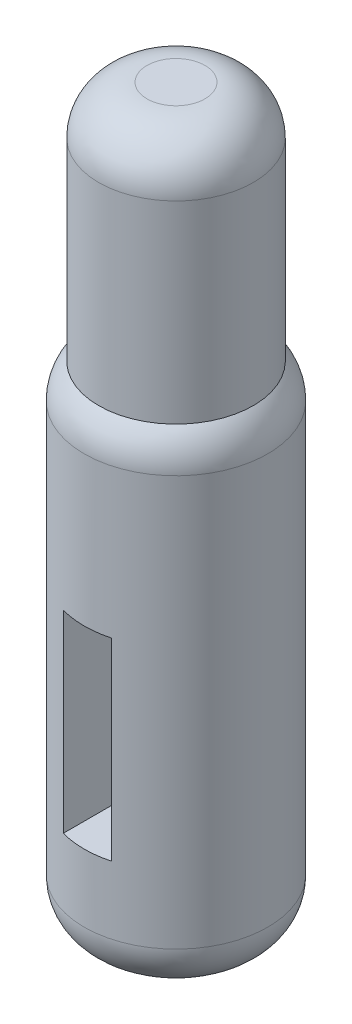
ISO-10303-21;
HEADER;
FILE_DESCRIPTION(('STEP AP214'),'2;1');
FILE_NAME('part.step','',(''),(''),'','','');
FILE_SCHEMA(('AUTOMOTIVE_DESIGN { 1 0 10303 214 1 1 1 1 }'));
ENDSEC;
DATA;
#1=APPLICATION_CONTEXT('core data for automotive mechanical design processes');
#2=APPLICATION_PROTOCOL_DEFINITION('international standard','automotive_design',2000,#1);
#3=PRODUCT_CONTEXT('',#1,'mechanical');
#4=PRODUCT('Part','Part','',(#3));
#5=PRODUCT_RELATED_PRODUCT_CATEGORY('part','',(#4));
#6=PRODUCT_DEFINITION_FORMATION('','',#4);
#7=PRODUCT_DEFINITION_CONTEXT('part definition',#1,'design');
#8=PRODUCT_DEFINITION('design','',#6,#7);
#9=PRODUCT_DEFINITION_SHAPE('','',#8);
#10=(LENGTH_UNIT() NAMED_UNIT(*) SI_UNIT(.MILLI.,.METRE.));
#11=(NAMED_UNIT(*) PLANE_ANGLE_UNIT() SI_UNIT($,.RADIAN.));
#12=(NAMED_UNIT(*) SI_UNIT($,.STERADIAN.) SOLID_ANGLE_UNIT());
#13=UNCERTAINTY_MEASURE_WITH_UNIT(LENGTH_MEASURE(1.E-05),#10,'distance_accuracy_value','');
#14=(GEOMETRIC_REPRESENTATION_CONTEXT(3) GLOBAL_UNCERTAINTY_ASSIGNED_CONTEXT((#13)) GLOBAL_UNIT_ASSIGNED_CONTEXT((#10,
#11,#12)) REPRESENTATION_CONTEXT('',''));
#15=CARTESIAN_POINT('',(0.,0.,0.));
#16=DIRECTION('',(0.,0.,1.));
#17=DIRECTION('',(1.,0.,0.));
#18=AXIS2_PLACEMENT_3D('',#15,#16,#17);
#19=CARTESIAN_POINT('',(0.,102.,0.));
#20=DIRECTION('',(0.,-1.,0.));
#21=DIRECTION('',(0.,0.,-1.));
#22=AXIS2_PLACEMENT_3D('',#19,#20,#21);
#23=CYLINDRICAL_SURFACE('',#22,19.);
#24=CARTESIAN_POINT('',(0.,64.,0.));
#25=DIRECTION('',(0.,-1.,0.));
#26=DIRECTION('',(0.,0.,-1.));
#27=AXIS2_PLACEMENT_3D('',#24,#25,#26);
#28=CIRCLE('',#27,19.);
#29=CARTESIAN_POINT('',(4.99999999999997,64.,18.3303027798234));
#30=VERTEX_POINT('',#29);
#31=CARTESIAN_POINT('',(-5.00000000000003,64.,18.3303027798234));
#32=VERTEX_POINT('',#31);
#33=EDGE_CURVE('E82',#30,#32,#28,.T.);
#34=ORIENTED_EDGE('',*,*,#33,.F.);
#35=DIRECTION('',(0.,-1.,0.));
#36=VECTOR('',#35,1.);
#37=CARTESIAN_POINT('',(4.99999999999996,102.,18.3303027798234));
#38=LINE('',#37,#36);
#39=CARTESIAN_POINT('',(4.99999999999999,24.,18.3303027798234));
#40=VERTEX_POINT('',#39);
#41=EDGE_CURVE('E47',#40,#30,#38,.F.);
#42=ORIENTED_EDGE('',*,*,#41,.F.);
#43=CARTESIAN_POINT('',(0.,24.,0.));
#44=DIRECTION('',(0.,-1.,0.));
#45=DIRECTION('',(0.,0.,-1.));
#46=AXIS2_PLACEMENT_3D('',#43,#44,#45);
#47=CIRCLE('',#46,19.);
#48=CARTESIAN_POINT('',(-5.00000000000002,24.,18.3303027798233));
#49=VERTEX_POINT('',#48);
#50=EDGE_CURVE('E87',#40,#49,#47,.T.);
#51=ORIENTED_EDGE('',*,*,#50,.T.);
#52=DIRECTION('',(0.,-1.,0.));
#53=VECTOR('',#52,1.);
#54=CARTESIAN_POINT('',(-5.00000000000004,102.,18.3303027798233));
#55=LINE('',#54,#53);
#56=EDGE_CURVE('E77',#49,#32,#55,.F.);
#57=ORIENTED_EDGE('',*,*,#56,.T.);
#58=EDGE_LOOP('',(#34,#42,#51,#57));
#59=FACE_BOUND('',#58,.T.);
#60=CARTESIAN_POINT('',(0.,9.99999999999999,0.));
#61=DIRECTION('',(0.,1.,0.));
#62=DIRECTION('',(0.,0.,1.));
#63=AXIS2_PLACEMENT_3D('',#60,#61,#62);
#64=CIRCLE('',#63,19.);
#65=CARTESIAN_POINT('',(0.,9.99999999999999,19.));
#66=VERTEX_POINT('',#65);
#67=EDGE_CURVE('E100',#66,#66,#64,.T.);
#68=ORIENTED_EDGE('',*,*,#67,.T.);
#69=EDGE_LOOP('',(#68));
#70=FACE_BOUND('',#69,.T.);
#71=CARTESIAN_POINT('',(0.,94.8585715714571,0.));
#72=DIRECTION('',(0.,1.,0.));
#73=DIRECTION('',(0.,0.,1.));
#74=AXIS2_PLACEMENT_3D('',#71,#72,#73);
#75=CIRCLE('',#74,19.);
#76=CARTESIAN_POINT('',(0.,94.8585715714571,19.));
#77=VERTEX_POINT('',#76);
#78=EDGE_CURVE('E117',#77,#77,#75,.F.);
#79=ORIENTED_EDGE('',*,*,#78,.T.);
#80=EDGE_LOOP('',(#79));
#81=FACE_BOUND('',#80,.T.);
#82=DIRECTION('',(0.,-1.,0.));
#83=VECTOR('',#82,1.);
#84=CARTESIAN_POINT('',(4.99999999999996,102.,-18.3303027798234));
#85=LINE('',#84,#83);
#86=CARTESIAN_POINT('',(4.99999999999997,64.,-18.3303027798234));
#87=VERTEX_POINT('',#86);
#88=CARTESIAN_POINT('',(4.99999999999999,24.,-18.3303027798234));
#89=VERTEX_POINT('',#88);
#90=EDGE_CURVE('E11',#87,#89,#85,.T.);
#91=ORIENTED_EDGE('',*,*,#90,.F.);
#92=CARTESIAN_POINT('',(-5.00000000000003,64.,-18.3303027798233));
#93=VERTEX_POINT('',#92);
#94=EDGE_CURVE('E98',#93,#87,#28,.T.);
#95=ORIENTED_EDGE('',*,*,#94,.F.);
#96=DIRECTION('',(0.,-1.,0.));
#97=VECTOR('',#96,1.);
#98=CARTESIAN_POINT('',(-5.00000000000004,102.,-18.3303027798233));
#99=LINE('',#98,#97);
#100=CARTESIAN_POINT('',(-5.00000000000002,24.,-18.3303027798234));
#101=VERTEX_POINT('',#100);
#102=EDGE_CURVE('E104',#93,#101,#99,.T.);
#103=ORIENTED_EDGE('',*,*,#102,.T.);
#104=EDGE_CURVE('E81',#101,#89,#47,.T.);
#105=ORIENTED_EDGE('',*,*,#104,.T.);
#106=EDGE_LOOP('',(#91,#95,#103,#105));
#107=FACE_BOUND('',#106,.T.);
#108=ADVANCED_FACE('F39',(#59,#70,#81,#107),#23,.T.);
#109=CARTESIAN_POINT('',(0.,0.,0.));
#110=DIRECTION('',(0.,1.,0.));
#111=DIRECTION('',(0.,0.,1.));
#112=AXIS2_PLACEMENT_3D('',#109,#110,#111);
#113=PLANE('',#112);
#114=CARTESIAN_POINT('',(0.,0.,0.));
#115=DIRECTION('',(0.,1.,0.));
#116=DIRECTION('',(0.,0.,1.));
#117=AXIS2_PLACEMENT_3D('',#114,#115,#116);
#118=CIRCLE('',#117,9.);
#119=CARTESIAN_POINT('',(0.,0.,9.));
#120=VERTEX_POINT('',#119);
#121=EDGE_CURVE('E95',#120,#120,#118,.F.);
#122=ORIENTED_EDGE('',*,*,#121,.T.);
#123=EDGE_LOOP('',(#122));
#124=FACE_BOUND('',#123,.T.);
#125=ADVANCED_FACE('F146',(#124),#113,.F.);
#126=CARTESIAN_POINT('',(0.,152.,0.));
#127=DIRECTION('',(0.,-1.,0.));
#128=DIRECTION('',(0.,0.,-1.));
#129=AXIS2_PLACEMENT_3D('',#126,#127,#128);
#130=CYLINDRICAL_SURFACE('',#129,16.);
#131=CARTESIAN_POINT('',(0.,142.,0.));
#132=DIRECTION('',(0.,1.,0.));
#133=DIRECTION('',(0.,0.,1.));
#134=AXIS2_PLACEMENT_3D('',#131,#132,#133);
#135=CIRCLE('',#134,16.);
#136=CARTESIAN_POINT('',(0.,142.,16.));
#137=VERTEX_POINT('',#136);
#138=EDGE_CURVE('E126',#137,#137,#135,.F.);
#139=ORIENTED_EDGE('',*,*,#138,.T.);
#140=EDGE_LOOP('',(#139));
#141=FACE_BOUND('',#140,.T.);
#142=CARTESIAN_POINT('',(0.,102.,0.));
#143=DIRECTION('',(0.,1.,0.));
#144=DIRECTION('',(0.,0.,1.));
#145=AXIS2_PLACEMENT_3D('',#142,#143,#144);
#146=CIRCLE('',#145,16.);
#147=CARTESIAN_POINT('',(0.,102.,16.));
#148=VERTEX_POINT('',#147);
#149=EDGE_CURVE('E114',#148,#148,#146,.T.);
#150=ORIENTED_EDGE('',*,*,#149,.T.);
#151=EDGE_LOOP('',(#150));
#152=FACE_BOUND('',#151,.T.);
#153=ADVANCED_FACE('F150',(#141,#152),#130,.T.);
#154=CARTESIAN_POINT('',(0.,152.,0.));
#155=DIRECTION('',(0.,1.,0.));
#156=DIRECTION('',(0.,0.,1.));
#157=AXIS2_PLACEMENT_3D('',#154,#155,#156);
#158=PLANE('',#157);
#159=CARTESIAN_POINT('',(0.,152.,0.));
#160=DIRECTION('',(0.,1.,0.));
#161=DIRECTION('',(0.,0.,1.));
#162=AXIS2_PLACEMENT_3D('',#159,#160,#161);
#163=CIRCLE('',#162,6.);
#164=CARTESIAN_POINT('',(0.,152.,6.));
#165=VERTEX_POINT('',#164);
#166=EDGE_CURVE('E123',#165,#165,#163,.T.);
#167=ORIENTED_EDGE('',*,*,#166,.T.);
#168=EDGE_LOOP('',(#167));
#169=FACE_BOUND('',#168,.T.);
#170=ADVANCED_FACE('F156',(#169),#158,.T.);
#171=CARTESIAN_POINT('',(0.,94.8585715714571,0.));
#172=DIRECTION('',(0.,1.,0.));
#173=DIRECTION('',(0.,0.,1.));
#174=AXIS2_PLACEMENT_3D('',#171,#172,#173);
#175=DEGENERATE_TOROIDAL_SURFACE('',#174,9.,10.,.T.);
#176=ORIENTED_EDGE('',*,*,#78,.F.);
#177=EDGE_LOOP('',(#176));
#178=FACE_BOUND('',#177,.T.);
#179=ORIENTED_EDGE('',*,*,#149,.F.);
#180=EDGE_LOOP('',(#179));
#181=FACE_BOUND('',#180,.T.);
#182=ADVANCED_FACE('F143',(#178,#181),#175,.T.);
#183=CARTESIAN_POINT('',(0.,142.,0.));
#184=DIRECTION('',(0.,1.,0.));
#185=DIRECTION('',(0.,0.,1.));
#186=AXIS2_PLACEMENT_3D('',#183,#184,#185);
#187=DEGENERATE_TOROIDAL_SURFACE('',#186,6.,10.,.T.);
#188=ORIENTED_EDGE('',*,*,#138,.F.);
#189=EDGE_LOOP('',(#188));
#190=FACE_BOUND('',#189,.T.);
#191=ORIENTED_EDGE('',*,*,#166,.F.);
#192=EDGE_LOOP('',(#191));
#193=FACE_BOUND('',#192,.T.);
#194=ADVANCED_FACE('F134',(#190,#193),#187,.T.);
#195=CARTESIAN_POINT('',(0.,9.99999999999999,0.));
#196=DIRECTION('',(0.,1.,0.));
#197=DIRECTION('',(0.,0.,1.));
#198=AXIS2_PLACEMENT_3D('',#195,#196,#197);
#199=DEGENERATE_TOROIDAL_SURFACE('',#198,9.,10.,.T.);
#200=ORIENTED_EDGE('',*,*,#121,.F.);
#201=EDGE_LOOP('',(#200));
#202=FACE_BOUND('',#201,.T.);
#203=ORIENTED_EDGE('',*,*,#67,.F.);
#204=EDGE_LOOP('',(#203));
#205=FACE_BOUND('',#204,.T.);
#206=ADVANCED_FACE('F41',(#202,#205),#199,.T.);
#207=CARTESIAN_POINT('',(-5.00000000000003,64.,-19.));
#208=DIRECTION('',(0.,-1.,0.));
#209=DIRECTION('',(0.,0.,-1.));
#210=AXIS2_PLACEMENT_3D('',#207,#208,#209);
#211=PLANE('',#210);
#212=DIRECTION('',(0.,0.,1.));
#213=VECTOR('',#212,1.);
#214=CARTESIAN_POINT('',(4.99999999999997,64.,-19.));
#215=LINE('',#214,#213);
#216=EDGE_CURVE('E112',#87,#30,#215,.T.);
#217=ORIENTED_EDGE('',*,*,#216,.T.);
#218=ORIENTED_EDGE('',*,*,#33,.T.);
#219=DIRECTION('',(0.,0.,1.));
#220=VECTOR('',#219,1.);
#221=CARTESIAN_POINT('',(-5.00000000000003,64.,-19.));
#222=LINE('',#221,#220);
#223=EDGE_CURVE('E59',#93,#32,#222,.T.);
#224=ORIENTED_EDGE('',*,*,#223,.F.);
#225=ORIENTED_EDGE('',*,*,#94,.T.);
#226=EDGE_LOOP('',(#217,#218,#224,#225));
#227=FACE_BOUND('',#226,.T.);
#228=ADVANCED_FACE('F113',(#227),#211,.T.);
#229=CARTESIAN_POINT('',(4.99999999999997,64.,-19.));
#230=DIRECTION('',(-1.,0.,0.));
#231=DIRECTION('',(0.,-1.,0.));
#232=AXIS2_PLACEMENT_3D('',#229,#230,#231);
#233=PLANE('',#232);
#234=ORIENTED_EDGE('',*,*,#90,.T.);
#235=DIRECTION('',(0.,0.,1.));
#236=VECTOR('',#235,1.);
#237=CARTESIAN_POINT('',(4.99999999999999,24.,-19.));
#238=LINE('',#237,#236);
#239=EDGE_CURVE('E90',#89,#40,#238,.T.);
#240=ORIENTED_EDGE('',*,*,#239,.T.);
#241=ORIENTED_EDGE('',*,*,#41,.T.);
#242=ORIENTED_EDGE('',*,*,#216,.F.);
#243=EDGE_LOOP('',(#234,#240,#241,#242));
#244=FACE_BOUND('',#243,.T.);
#245=ADVANCED_FACE('F111',(#244),#233,.T.);
#246=CARTESIAN_POINT('',(-5.00000000000002,24.,-19.));
#247=DIRECTION('',(0.,-1.,0.));
#248=DIRECTION('',(0.,0.,-1.));
#249=AXIS2_PLACEMENT_3D('',#246,#247,#248);
#250=PLANE('',#249);
#251=ORIENTED_EDGE('',*,*,#239,.F.);
#252=ORIENTED_EDGE('',*,*,#104,.F.);
#253=DIRECTION('',(0.,0.,1.));
#254=VECTOR('',#253,1.);
#255=CARTESIAN_POINT('',(-5.00000000000002,24.,-19.));
#256=LINE('',#255,#254);
#257=EDGE_CURVE('E54',#101,#49,#256,.T.);
#258=ORIENTED_EDGE('',*,*,#257,.T.);
#259=ORIENTED_EDGE('',*,*,#50,.F.);
#260=EDGE_LOOP('',(#251,#252,#258,#259));
#261=FACE_BOUND('',#260,.T.);
#262=ADVANCED_FACE('F86',(#261),#250,.F.);
#263=CARTESIAN_POINT('',(-5.00000000000003,64.,-19.));
#264=DIRECTION('',(-1.,0.,0.));
#265=DIRECTION('',(0.,-1.,0.));
#266=AXIS2_PLACEMENT_3D('',#263,#264,#265);
#267=PLANE('',#266);
#268=ORIENTED_EDGE('',*,*,#223,.T.);
#269=ORIENTED_EDGE('',*,*,#56,.F.);
#270=ORIENTED_EDGE('',*,*,#257,.F.);
#271=ORIENTED_EDGE('',*,*,#102,.F.);
#272=EDGE_LOOP('',(#268,#269,#270,#271));
#273=FACE_BOUND('',#272,.T.);
#274=ADVANCED_FACE('F78',(#273),#267,.F.);
#275=CLOSED_SHELL('',(#108,#125,#153,#170,#182,#194,#206,#228,#245,#262,#274));
#276=MANIFOLD_SOLID_BREP('B2',#275);
#277=ADVANCED_BREP_SHAPE_REPRESENTATION('',(#18,#276),#14);
#278=SHAPE_DEFINITION_REPRESENTATION(#9,#277);
ENDSEC;
END-ISO-10303-21;
